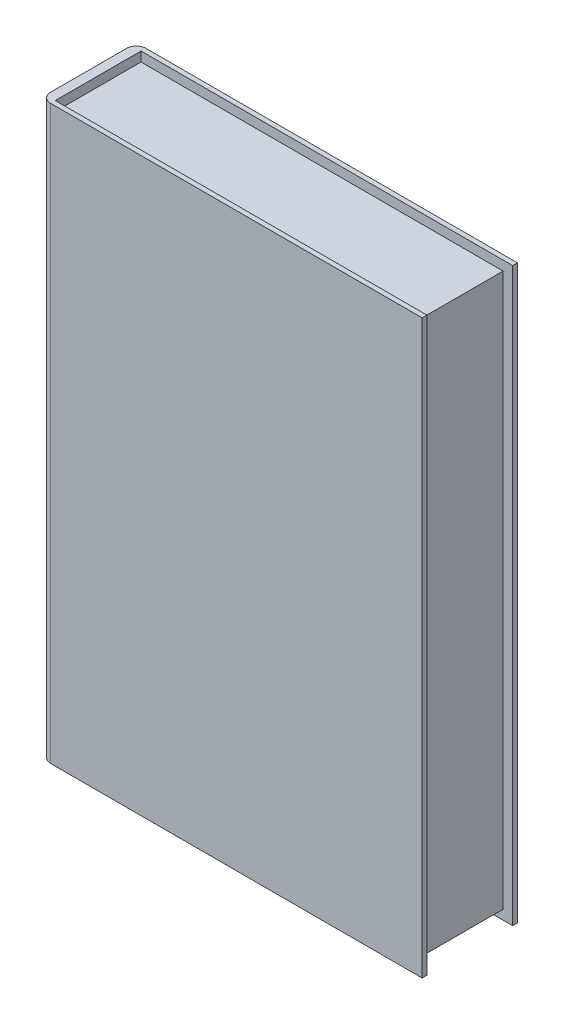
ISO-10303-21;
HEADER;
FILE_DESCRIPTION(('STEP AP214'),'2;1');
FILE_NAME('part.step','',(''),(''),'','','');
FILE_SCHEMA(('AUTOMOTIVE_DESIGN { 1 0 10303 214 1 1 1 1 }'));
ENDSEC;
DATA;
#1=APPLICATION_CONTEXT('core data for automotive mechanical design processes');
#2=APPLICATION_PROTOCOL_DEFINITION('international standard','automotive_design',2000,#1);
#3=PRODUCT_CONTEXT('',#1,'mechanical');
#4=PRODUCT('Part','Part','',(#3));
#5=PRODUCT_RELATED_PRODUCT_CATEGORY('part','',(#4));
#6=PRODUCT_DEFINITION_FORMATION('','',#4);
#7=PRODUCT_DEFINITION_CONTEXT('part definition',#1,'design');
#8=PRODUCT_DEFINITION('design','',#6,#7);
#9=PRODUCT_DEFINITION_SHAPE('','',#8);
#10=(LENGTH_UNIT() NAMED_UNIT(*) SI_UNIT(.MILLI.,.METRE.));
#11=(NAMED_UNIT(*) PLANE_ANGLE_UNIT() SI_UNIT($,.RADIAN.));
#12=(NAMED_UNIT(*) SI_UNIT($,.STERADIAN.) SOLID_ANGLE_UNIT());
#13=UNCERTAINTY_MEASURE_WITH_UNIT(LENGTH_MEASURE(1.E-05),#10,'distance_accuracy_value','');
#14=(GEOMETRIC_REPRESENTATION_CONTEXT(3) GLOBAL_UNCERTAINTY_ASSIGNED_CONTEXT((#13)) GLOBAL_UNIT_ASSIGNED_CONTEXT((#10,
#11,#12)) REPRESENTATION_CONTEXT('',''));
#15=CARTESIAN_POINT('',(0.,0.,0.));
#16=DIRECTION('',(0.,0.,1.));
#17=DIRECTION('',(1.,0.,0.));
#18=AXIS2_PLACEMENT_3D('',#15,#16,#17);
#19=CARTESIAN_POINT('',(78.4210526315789,31.8421052631579,10.));
#20=DIRECTION('',(-1.,0.,0.));
#21=DIRECTION('',(0.,-1.,0.));
#22=AXIS2_PLACEMENT_3D('',#19,#20,#21);
#23=PLANE('',#22);
#24=DIRECTION('',(0.,0.,-1.));
#25=VECTOR('',#24,1.);
#26=CARTESIAN_POINT('',(78.421052631579,-88.1578947368421,10.));
#27=LINE('',#26,#25);
#28=CARTESIAN_POINT('',(78.421052631579,-88.1578947368421,10.));
#29=VERTEX_POINT('',#28);
#30=CARTESIAN_POINT('',(78.421052631579,-88.1578947368421,9.));
#31=VERTEX_POINT('',#30);
#32=EDGE_CURVE('E224',#29,#31,#27,.T.);
#33=ORIENTED_EDGE('',*,*,#32,.T.);
#34=DIRECTION('',(0.,1.,0.));
#35=VECTOR('',#34,1.);
#36=CARTESIAN_POINT('',(78.4210526315789,29.8421052631579,9.));
#37=LINE('',#36,#35);
#38=CARTESIAN_POINT('',(78.4210526315789,31.8421052631579,9.));
#39=VERTEX_POINT('',#38);
#40=EDGE_CURVE('E200',#31,#39,#37,.T.);
#41=ORIENTED_EDGE('',*,*,#40,.T.);
#42=DIRECTION('',(0.,0.,-1.));
#43=VECTOR('',#42,1.);
#44=CARTESIAN_POINT('',(78.4210526315789,31.8421052631579,10.));
#45=LINE('',#44,#43);
#46=CARTESIAN_POINT('',(78.4210526315789,31.8421052631579,10.));
#47=VERTEX_POINT('',#46);
#48=EDGE_CURVE('E220',#47,#39,#45,.T.);
#49=ORIENTED_EDGE('',*,*,#48,.F.);
#50=DIRECTION('',(0.,1.,0.));
#51=VECTOR('',#50,1.);
#52=CARTESIAN_POINT('',(78.4210526315789,31.8421052631579,10.));
#53=LINE('',#52,#51);
#54=EDGE_CURVE('E206',#29,#47,#53,.T.);
#55=ORIENTED_EDGE('',*,*,#54,.F.);
#56=EDGE_LOOP('',(#33,#41,#49,#55));
#57=FACE_BOUND('',#56,.T.);
#58=ADVANCED_FACE('F32',(#57),#23,.F.);
#59=CARTESIAN_POINT('',(76.4210526315789,0.,0.));
#60=DIRECTION('',(1.,0.,0.));
#61=DIRECTION('',(0.,1.,0.));
#62=AXIS2_PLACEMENT_3D('',#59,#60,#61);
#63=PLANE('',#62);
#64=DIRECTION('',(0.,-1.,0.));
#65=VECTOR('',#64,1.);
#66=CARTESIAN_POINT('',(76.4210526315789,29.8421052631579,9.));
#67=LINE('',#66,#65);
#68=CARTESIAN_POINT('',(76.4210526315789,29.8421052631579,9.));
#69=VERTEX_POINT('',#68);
#70=CARTESIAN_POINT('',(76.421052631579,-86.1578947368421,9.));
#71=VERTEX_POINT('',#70);
#72=EDGE_CURVE('E170',#69,#71,#67,.T.);
#73=ORIENTED_EDGE('',*,*,#72,.T.);
#74=DIRECTION('',(0.,0.,-1.));
#75=VECTOR('',#74,1.);
#76=CARTESIAN_POINT('',(76.421052631579,-86.1578947368421,0.));
#77=LINE('',#76,#75);
#78=CARTESIAN_POINT('',(76.421052631579,-86.1578947368421,-9.00000000000001));
#79=VERTEX_POINT('',#78);
#80=EDGE_CURVE('E230',#71,#79,#77,.T.);
#81=ORIENTED_EDGE('',*,*,#80,.T.);
#82=DIRECTION('',(0.,1.,0.));
#83=VECTOR('',#82,1.);
#84=CARTESIAN_POINT('',(76.4210526315789,29.8421052631579,-9.));
#85=LINE('',#84,#83);
#86=CARTESIAN_POINT('',(76.4210526315789,29.8421052631579,-9.));
#87=VERTEX_POINT('',#86);
#88=EDGE_CURVE('E154',#79,#87,#85,.T.);
#89=ORIENTED_EDGE('',*,*,#88,.T.);
#90=DIRECTION('',(0.,0.,1.));
#91=VECTOR('',#90,1.);
#92=CARTESIAN_POINT('',(76.4210526315789,29.8421052631579,9.));
#93=LINE('',#92,#91);
#94=EDGE_CURVE('E175',#87,#69,#93,.T.);
#95=ORIENTED_EDGE('',*,*,#94,.T.);
#96=EDGE_LOOP('',(#73,#81,#89,#95));
#97=FACE_BOUND('',#96,.T.);
#98=ADVANCED_FACE('F275',(#97),#63,.T.);
#99=CARTESIAN_POINT('',(0.,29.8421052631579,0.));
#100=DIRECTION('',(0.,1.,0.));
#101=DIRECTION('',(0.,0.,1.));
#102=AXIS2_PLACEMENT_3D('',#99,#100,#101);
#103=PLANE('',#102);
#104=DIRECTION('',(1.,0.,0.));
#105=VECTOR('',#104,1.);
#106=CARTESIAN_POINT('',(0.421052631578948,29.8421052631579,9.));
#107=LINE('',#106,#105);
#108=CARTESIAN_POINT('',(0.421052631578948,29.8421052631579,9.));
#109=VERTEX_POINT('',#108);
#110=EDGE_CURVE('E182',#109,#69,#107,.T.);
#111=ORIENTED_EDGE('',*,*,#110,.T.);
#112=ORIENTED_EDGE('',*,*,#94,.F.);
#113=DIRECTION('',(-1.,0.,0.));
#114=VECTOR('',#113,1.);
#115=CARTESIAN_POINT('',(0.421052631578945,29.8421052631579,-9.));
#116=LINE('',#115,#114);
#117=CARTESIAN_POINT('',(0.421052631578945,29.8421052631579,-9.));
#118=VERTEX_POINT('',#117);
#119=EDGE_CURVE('E186',#87,#118,#116,.T.);
#120=ORIENTED_EDGE('',*,*,#119,.T.);
#121=DIRECTION('',(0.,0.,1.));
#122=VECTOR('',#121,1.);
#123=CARTESIAN_POINT('',(0.421052631578945,29.8421052631579,-9.));
#124=LINE('',#123,#122);
#125=EDGE_CURVE('E179',#118,#109,#124,.T.);
#126=ORIENTED_EDGE('',*,*,#125,.T.);
#127=EDGE_LOOP('',(#111,#112,#120,#126));
#128=FACE_BOUND('',#127,.T.);
#129=ADVANCED_FACE('F273',(#128),#103,.T.);
#130=CARTESIAN_POINT('',(-1.57894736842105,31.8421052631579,10.));
#131=DIRECTION('',(1.,0.,0.));
#132=DIRECTION('',(0.,1.,0.));
#133=AXIS2_PLACEMENT_3D('',#130,#131,#132);
#134=PLANE('',#133);
#135=DIRECTION('',(0.,0.,-1.));
#136=VECTOR('',#135,1.);
#137=CARTESIAN_POINT('',(-1.57894736842105,31.8421052631579,10.));
#138=LINE('',#137,#136);
#139=CARTESIAN_POINT('',(-1.57894736842105,31.8421052631579,8.));
#140=VERTEX_POINT('',#139);
#141=CARTESIAN_POINT('',(-1.57894736842105,31.8421052631579,-8.));
#142=VERTEX_POINT('',#141);
#143=EDGE_CURVE('E211',#140,#142,#138,.T.);
#144=ORIENTED_EDGE('',*,*,#143,.T.);
#145=DIRECTION('',(0.,-1.,0.));
#146=VECTOR('',#145,1.);
#147=CARTESIAN_POINT('',(-1.57894736842105,31.8421052631579,-8.));
#148=LINE('',#147,#146);
#149=CARTESIAN_POINT('',(-1.57894736842104,-88.1578947368421,-8.));
#150=VERTEX_POINT('',#149);
#151=EDGE_CURVE('E234',#142,#150,#148,.T.);
#152=ORIENTED_EDGE('',*,*,#151,.T.);
#153=DIRECTION('',(0.,0.,-1.));
#154=VECTOR('',#153,1.);
#155=CARTESIAN_POINT('',(-1.57894736842104,-88.1578947368421,10.));
#156=LINE('',#155,#154);
#157=CARTESIAN_POINT('',(-1.57894736842104,-88.1578947368421,8.));
#158=VERTEX_POINT('',#157);
#159=EDGE_CURVE('E227',#158,#150,#156,.T.);
#160=ORIENTED_EDGE('',*,*,#159,.F.);
#161=DIRECTION('',(0.,-1.,0.));
#162=VECTOR('',#161,1.);
#163=CARTESIAN_POINT('',(-1.57894736842105,31.8421052631579,8.));
#164=LINE('',#163,#162);
#165=EDGE_CURVE('E232',#158,#140,#164,.F.);
#166=ORIENTED_EDGE('',*,*,#165,.T.);
#167=EDGE_LOOP('',(#144,#152,#160,#166));
#168=FACE_BOUND('',#167,.T.);
#169=ADVANCED_FACE('F247',(#168),#134,.F.);
#170=CARTESIAN_POINT('',(-1.57894736842104,-88.1578947368421,10.));
#171=DIRECTION('',(0.,1.,0.));
#172=DIRECTION('',(0.,0.,1.));
#173=AXIS2_PLACEMENT_3D('',#170,#171,#172);
#174=PLANE('',#173);
#175=ORIENTED_EDGE('',*,*,#159,.T.);
#176=CARTESIAN_POINT('',(0.42105263157896,-88.1578947368421,-8.));
#177=DIRECTION('',(0.,1.,0.));
#178=DIRECTION('',(0.,0.,1.));
#179=AXIS2_PLACEMENT_3D('',#176,#177,#178);
#180=CIRCLE('',#179,2.);
#181=CARTESIAN_POINT('',(0.42105263157896,-88.1578947368421,-10.));
#182=VERTEX_POINT('',#181);
#183=EDGE_CURVE('E239',#150,#182,#180,.F.);
#184=ORIENTED_EDGE('',*,*,#183,.T.);
#185=DIRECTION('',(1.,0.,0.));
#186=VECTOR('',#185,1.);
#187=CARTESIAN_POINT('',(-1.57894736842104,-88.1578947368421,-10.));
#188=LINE('',#187,#186);
#189=CARTESIAN_POINT('',(78.421052631579,-88.1578947368421,-10.));
#190=VERTEX_POINT('',#189);
#191=EDGE_CURVE('E197',#182,#190,#188,.T.);
#192=ORIENTED_EDGE('',*,*,#191,.T.);
#193=CARTESIAN_POINT('',(78.421052631579,-88.1578947368421,-9.));
#194=VERTEX_POINT('',#193);
#195=EDGE_CURVE('E223',#194,#190,#27,.T.);
#196=ORIENTED_EDGE('',*,*,#195,.F.);
#197=DIRECTION('',(1.,0.,0.));
#198=VECTOR('',#197,1.);
#199=CARTESIAN_POINT('',(0.421052631578962,-88.1578947368421,-9.));
#200=LINE('',#199,#198);
#201=CARTESIAN_POINT('',(0.421052631578962,-88.1578947368421,-9.));
#202=VERTEX_POINT('',#201);
#203=EDGE_CURVE('E164',#202,#194,#200,.T.);
#204=ORIENTED_EDGE('',*,*,#203,.F.);
#205=DIRECTION('',(0.,0.,-1.));
#206=VECTOR('',#205,1.);
#207=CARTESIAN_POINT('',(0.42105263157896,-88.1578947368421,9.));
#208=LINE('',#207,#206);
#209=CARTESIAN_POINT('',(0.42105263157896,-88.1578947368421,9.));
#210=VERTEX_POINT('',#209);
#211=EDGE_CURVE('E143',#210,#202,#208,.T.);
#212=ORIENTED_EDGE('',*,*,#211,.F.);
#213=DIRECTION('',(-1.,0.,0.));
#214=VECTOR('',#213,1.);
#215=CARTESIAN_POINT('',(0.42105263157896,-88.1578947368421,9.));
#216=LINE('',#215,#214);
#217=EDGE_CURVE('E161',#31,#210,#216,.T.);
#218=ORIENTED_EDGE('',*,*,#217,.F.);
#219=ORIENTED_EDGE('',*,*,#32,.F.);
#220=DIRECTION('',(1.,0.,0.));
#221=VECTOR('',#220,1.);
#222=CARTESIAN_POINT('',(-1.57894736842104,-88.1578947368421,10.));
#223=LINE('',#222,#221);
#224=CARTESIAN_POINT('',(0.42105263157896,-88.1578947368421,10.));
#225=VERTEX_POINT('',#224);
#226=EDGE_CURVE('E204',#225,#29,#223,.T.);
#227=ORIENTED_EDGE('',*,*,#226,.F.);
#228=CARTESIAN_POINT('',(0.42105263157896,-88.1578947368421,8.));
#229=DIRECTION('',(0.,1.,0.));
#230=DIRECTION('',(0.,0.,1.));
#231=AXIS2_PLACEMENT_3D('',#228,#229,#230);
#232=CIRCLE('',#231,2.);
#233=EDGE_CURVE('E237',#225,#158,#232,.F.);
#234=ORIENTED_EDGE('',*,*,#233,.T.);
#235=EDGE_LOOP('',(#175,#184,#192,#196,#204,#212,#218,#219,#227,#234));
#236=FACE_BOUND('',#235,.T.);
#237=ADVANCED_FACE('F252',(#236),#174,.F.);
#238=DIRECTION('',(0.,1.,0.));
#239=VECTOR('',#238,1.);
#240=CARTESIAN_POINT('',(78.4210526315789,29.8421052631579,-9.));
#241=LINE('',#240,#239);
#242=CARTESIAN_POINT('',(78.4210526315789,31.8421052631579,-9.));
#243=VERTEX_POINT('',#242);
#244=EDGE_CURVE('E198',#194,#243,#241,.T.);
#245=ORIENTED_EDGE('',*,*,#244,.F.);
#246=ORIENTED_EDGE('',*,*,#195,.T.);
#247=DIRECTION('',(0.,1.,0.));
#248=VECTOR('',#247,1.);
#249=CARTESIAN_POINT('',(78.4210526315789,31.8421052631579,-10.));
#250=LINE('',#249,#248);
#251=CARTESIAN_POINT('',(78.4210526315789,31.8421052631579,-10.));
#252=VERTEX_POINT('',#251);
#253=EDGE_CURVE('E213',#190,#252,#250,.T.);
#254=ORIENTED_EDGE('',*,*,#253,.T.);
#255=EDGE_CURVE('E219',#243,#252,#45,.T.);
#256=ORIENTED_EDGE('',*,*,#255,.F.);
#257=EDGE_LOOP('',(#245,#246,#254,#256));
#258=FACE_BOUND('',#257,.T.);
#259=ADVANCED_FACE('F259',(#258),#23,.F.);
#260=CARTESIAN_POINT('',(-1.57894736842105,31.8421052631579,10.));
#261=DIRECTION('',(0.,-1.,0.));
#262=DIRECTION('',(0.,0.,-1.));
#263=AXIS2_PLACEMENT_3D('',#260,#261,#262);
#264=PLANE('',#263);
#265=DIRECTION('',(-1.,0.,0.));
#266=VECTOR('',#265,1.);
#267=CARTESIAN_POINT('',(-1.57894736842105,31.8421052631579,-10.));
#268=LINE('',#267,#266);
#269=CARTESIAN_POINT('',(0.421052631578945,31.8421052631579,-10.));
#270=VERTEX_POINT('',#269);
#271=EDGE_CURVE('E207',#252,#270,#268,.T.);
#272=ORIENTED_EDGE('',*,*,#271,.T.);
#273=CARTESIAN_POINT('',(0.421052631578945,31.8421052631579,-8.));
#274=DIRECTION('',(0.,-1.,0.));
#275=DIRECTION('',(0.,0.,-1.));
#276=AXIS2_PLACEMENT_3D('',#273,#274,#275);
#277=CIRCLE('',#276,2.);
#278=EDGE_CURVE('E40',#270,#142,#277,.F.);
#279=ORIENTED_EDGE('',*,*,#278,.T.);
#280=ORIENTED_EDGE('',*,*,#143,.F.);
#281=CARTESIAN_POINT('',(0.421052631578945,31.8421052631579,8.));
#282=DIRECTION('',(0.,-1.,0.));
#283=DIRECTION('',(0.,0.,-1.));
#284=AXIS2_PLACEMENT_3D('',#281,#282,#283);
#285=CIRCLE('',#284,2.);
#286=CARTESIAN_POINT('',(0.421052631578945,31.8421052631579,10.));
#287=VERTEX_POINT('',#286);
#288=EDGE_CURVE('E47',#140,#287,#285,.F.);
#289=ORIENTED_EDGE('',*,*,#288,.T.);
#290=DIRECTION('',(-1.,0.,0.));
#291=VECTOR('',#290,1.);
#292=CARTESIAN_POINT('',(-1.57894736842105,31.8421052631579,10.));
#293=LINE('',#292,#291);
#294=EDGE_CURVE('E209',#47,#287,#293,.T.);
#295=ORIENTED_EDGE('',*,*,#294,.F.);
#296=ORIENTED_EDGE('',*,*,#48,.T.);
#297=DIRECTION('',(1.,0.,0.));
#298=VECTOR('',#297,1.);
#299=CARTESIAN_POINT('',(0.421052631578948,31.8421052631579,9.));
#300=LINE('',#299,#298);
#301=CARTESIAN_POINT('',(0.421052631578947,31.8421052631579,9.));
#302=VERTEX_POINT('',#301);
#303=EDGE_CURVE('E190',#302,#39,#300,.T.);
#304=ORIENTED_EDGE('',*,*,#303,.F.);
#305=DIRECTION('',(0.,0.,1.));
#306=VECTOR('',#305,1.);
#307=CARTESIAN_POINT('',(0.421052631578945,31.8421052631579,-9.));
#308=LINE('',#307,#306);
#309=CARTESIAN_POINT('',(0.421052631578945,31.8421052631579,-9.));
#310=VERTEX_POINT('',#309);
#311=EDGE_CURVE('E178',#310,#302,#308,.T.);
#312=ORIENTED_EDGE('',*,*,#311,.F.);
#313=DIRECTION('',(-1.,0.,0.));
#314=VECTOR('',#313,1.);
#315=CARTESIAN_POINT('',(0.421052631578945,31.8421052631579,-9.));
#316=LINE('',#315,#314);
#317=EDGE_CURVE('E183',#243,#310,#316,.T.);
#318=ORIENTED_EDGE('',*,*,#317,.F.);
#319=ORIENTED_EDGE('',*,*,#255,.T.);
#320=EDGE_LOOP('',(#272,#279,#280,#289,#295,#296,#304,#312,#318,#319));
#321=FACE_BOUND('',#320,.T.);
#322=ADVANCED_FACE('F243',(#321),#264,.F.);
#323=CARTESIAN_POINT('',(0.,0.,10.));
#324=DIRECTION('',(0.,0.,1.));
#325=DIRECTION('',(1.,0.,0.));
#326=AXIS2_PLACEMENT_3D('',#323,#324,#325);
#327=PLANE('',#326);
#328=ORIENTED_EDGE('',*,*,#294,.T.);
#329=DIRECTION('',(0.,-1.,0.));
#330=VECTOR('',#329,1.);
#331=CARTESIAN_POINT('',(0.42105263157896,-88.1578947368421,10.));
#332=LINE('',#331,#330);
#333=EDGE_CURVE('E11',#287,#225,#332,.T.);
#334=ORIENTED_EDGE('',*,*,#333,.T.);
#335=ORIENTED_EDGE('',*,*,#226,.T.);
#336=ORIENTED_EDGE('',*,*,#54,.T.);
#337=EDGE_LOOP('',(#328,#334,#335,#336));
#338=FACE_BOUND('',#337,.T.);
#339=ADVANCED_FACE('F282',(#338),#327,.T.);
#340=CARTESIAN_POINT('',(0.,0.,-10.));
#341=DIRECTION('',(0.,0.,1.));
#342=DIRECTION('',(1.,0.,0.));
#343=AXIS2_PLACEMENT_3D('',#340,#341,#342);
#344=PLANE('',#343);
#345=ORIENTED_EDGE('',*,*,#191,.F.);
#346=DIRECTION('',(0.,-1.,0.));
#347=VECTOR('',#346,1.);
#348=CARTESIAN_POINT('',(0.421052631578949,0.,-10.));
#349=LINE('',#348,#347);
#350=EDGE_CURVE('E55',#182,#270,#349,.F.);
#351=ORIENTED_EDGE('',*,*,#350,.T.);
#352=ORIENTED_EDGE('',*,*,#271,.F.);
#353=ORIENTED_EDGE('',*,*,#253,.F.);
#354=EDGE_LOOP('',(#345,#351,#352,#353));
#355=FACE_BOUND('',#354,.T.);
#356=ADVANCED_FACE('F256',(#355),#344,.F.);
#357=CARTESIAN_POINT('',(0.421052631578945,29.8421052631579,-9.));
#358=DIRECTION('',(-1.,0.,0.));
#359=DIRECTION('',(0.,0.,1.));
#360=AXIS2_PLACEMENT_3D('',#357,#358,#359);
#361=PLANE('',#360);
#362=ORIENTED_EDGE('',*,*,#311,.T.);
#363=DIRECTION('',(0.,1.,0.));
#364=VECTOR('',#363,1.);
#365=CARTESIAN_POINT('',(0.421052631578948,29.8421052631579,9.));
#366=LINE('',#365,#364);
#367=EDGE_CURVE('E188',#109,#302,#366,.T.);
#368=ORIENTED_EDGE('',*,*,#367,.F.);
#369=ORIENTED_EDGE('',*,*,#125,.F.);
#370=DIRECTION('',(0.,1.,0.));
#371=VECTOR('',#370,1.);
#372=CARTESIAN_POINT('',(0.421052631578945,29.8421052631579,-9.));
#373=LINE('',#372,#371);
#374=EDGE_CURVE('E195',#118,#310,#373,.T.);
#375=ORIENTED_EDGE('',*,*,#374,.T.);
#376=EDGE_LOOP('',(#362,#368,#369,#375));
#377=FACE_BOUND('',#376,.T.);
#378=ADVANCED_FACE('F266',(#377),#361,.F.);
#379=CARTESIAN_POINT('',(0.421052631578945,29.8421052631579,-9.));
#380=DIRECTION('',(0.,0.,-1.));
#381=DIRECTION('',(-1.,0.,0.));
#382=AXIS2_PLACEMENT_3D('',#379,#380,#381);
#383=PLANE('',#382);
#384=ORIENTED_EDGE('',*,*,#203,.T.);
#385=ORIENTED_EDGE('',*,*,#244,.T.);
#386=ORIENTED_EDGE('',*,*,#317,.T.);
#387=ORIENTED_EDGE('',*,*,#374,.F.);
#388=ORIENTED_EDGE('',*,*,#119,.F.);
#389=ORIENTED_EDGE('',*,*,#88,.F.);
#390=DIRECTION('',(1.,0.,0.));
#391=VECTOR('',#390,1.);
#392=CARTESIAN_POINT('',(0.421052631578962,-86.1578947368421,-9.));
#393=LINE('',#392,#391);
#394=CARTESIAN_POINT('',(0.421052631578962,-86.1578947368421,-9.));
#395=VERTEX_POINT('',#394);
#396=EDGE_CURVE('E151',#395,#79,#393,.T.);
#397=ORIENTED_EDGE('',*,*,#396,.F.);
#398=DIRECTION('',(0.,-1.,0.));
#399=VECTOR('',#398,1.);
#400=CARTESIAN_POINT('',(0.421052631578962,-86.1578947368421,-9.));
#401=LINE('',#400,#399);
#402=EDGE_CURVE('E137',#395,#202,#401,.T.);
#403=ORIENTED_EDGE('',*,*,#402,.T.);
#404=EDGE_LOOP('',(#384,#385,#386,#387,#388,#389,#397,#403));
#405=FACE_BOUND('',#404,.T.);
#406=ADVANCED_FACE('F152',(#405),#383,.F.);
#407=CARTESIAN_POINT('',(0.421052631578948,29.8421052631579,9.));
#408=DIRECTION('',(0.,0.,1.));
#409=DIRECTION('',(1.,0.,0.));
#410=AXIS2_PLACEMENT_3D('',#407,#408,#409);
#411=PLANE('',#410);
#412=ORIENTED_EDGE('',*,*,#40,.F.);
#413=ORIENTED_EDGE('',*,*,#217,.T.);
#414=DIRECTION('',(0.,-1.,0.));
#415=VECTOR('',#414,1.);
#416=CARTESIAN_POINT('',(0.42105263157896,-86.1578947368421,9.));
#417=LINE('',#416,#415);
#418=CARTESIAN_POINT('',(0.42105263157896,-86.1578947368421,9.));
#419=VERTEX_POINT('',#418);
#420=EDGE_CURVE('E147',#419,#210,#417,.T.);
#421=ORIENTED_EDGE('',*,*,#420,.F.);
#422=DIRECTION('',(-1.,0.,0.));
#423=VECTOR('',#422,1.);
#424=CARTESIAN_POINT('',(0.42105263157896,-86.1578947368421,9.));
#425=LINE('',#424,#423);
#426=EDGE_CURVE('E148',#71,#419,#425,.T.);
#427=ORIENTED_EDGE('',*,*,#426,.F.);
#428=ORIENTED_EDGE('',*,*,#72,.F.);
#429=ORIENTED_EDGE('',*,*,#110,.F.);
#430=ORIENTED_EDGE('',*,*,#367,.T.);
#431=ORIENTED_EDGE('',*,*,#303,.T.);
#432=EDGE_LOOP('',(#412,#413,#421,#427,#428,#429,#430,#431));
#433=FACE_BOUND('',#432,.T.);
#434=ADVANCED_FACE('F270',(#433),#411,.F.);
#435=CARTESIAN_POINT('',(0.42105263157896,-86.1578947368421,9.));
#436=DIRECTION('',(-1.,0.,0.));
#437=DIRECTION('',(0.,0.,1.));
#438=AXIS2_PLACEMENT_3D('',#435,#436,#437);
#439=PLANE('',#438);
#440=ORIENTED_EDGE('',*,*,#211,.T.);
#441=ORIENTED_EDGE('',*,*,#402,.F.);
#442=DIRECTION('',(0.,0.,-1.));
#443=VECTOR('',#442,1.);
#444=CARTESIAN_POINT('',(0.42105263157896,-86.1578947368421,9.));
#445=LINE('',#444,#443);
#446=EDGE_CURVE('E141',#419,#395,#445,.T.);
#447=ORIENTED_EDGE('',*,*,#446,.F.);
#448=ORIENTED_EDGE('',*,*,#420,.T.);
#449=EDGE_LOOP('',(#440,#441,#447,#448));
#450=FACE_BOUND('',#449,.T.);
#451=ADVANCED_FACE('F139',(#450),#439,.F.);
#452=CARTESIAN_POINT('',(0.,-86.1578947368421,0.));
#453=DIRECTION('',(0.,-1.,0.));
#454=DIRECTION('',(0.,0.,-1.));
#455=AXIS2_PLACEMENT_3D('',#452,#453,#454);
#456=PLANE('',#455);
#457=ORIENTED_EDGE('',*,*,#426,.T.);
#458=ORIENTED_EDGE('',*,*,#446,.T.);
#459=ORIENTED_EDGE('',*,*,#396,.T.);
#460=ORIENTED_EDGE('',*,*,#80,.F.);
#461=EDGE_LOOP('',(#457,#458,#459,#460));
#462=FACE_BOUND('',#461,.T.);
#463=ADVANCED_FACE('F158',(#462),#456,.T.);
#464=CARTESIAN_POINT('',(0.421052631578945,31.8421052631579,-8.));
#465=DIRECTION('',(0.,-1.,0.));
#466=DIRECTION('',(1.,0.,0.));
#467=AXIS2_PLACEMENT_3D('',#464,#465,#466);
#468=CYLINDRICAL_SURFACE('',#467,2.);
#469=ORIENTED_EDGE('',*,*,#278,.F.);
#470=ORIENTED_EDGE('',*,*,#350,.F.);
#471=ORIENTED_EDGE('',*,*,#183,.F.);
#472=ORIENTED_EDGE('',*,*,#151,.F.);
#473=EDGE_LOOP('',(#469,#470,#471,#472));
#474=FACE_BOUND('',#473,.T.);
#475=ADVANCED_FACE('F250',(#474),#468,.T.);
#476=CARTESIAN_POINT('',(0.421052631578949,0.,8.));
#477=DIRECTION('',(0.,1.,0.));
#478=DIRECTION('',(-1.,0.,0.));
#479=AXIS2_PLACEMENT_3D('',#476,#477,#478);
#480=CYLINDRICAL_SURFACE('',#479,2.);
#481=ORIENTED_EDGE('',*,*,#288,.F.);
#482=ORIENTED_EDGE('',*,*,#165,.F.);
#483=ORIENTED_EDGE('',*,*,#233,.F.);
#484=ORIENTED_EDGE('',*,*,#333,.F.);
#485=EDGE_LOOP('',(#481,#482,#483,#484));
#486=FACE_BOUND('',#485,.T.);
#487=ADVANCED_FACE('F34',(#486),#480,.T.);
#488=CLOSED_SHELL('',(#58,#98,#129,#169,#237,#259,#322,#339,#356,#378,#406,#434,#451,#463,#475,#487));
#489=MANIFOLD_SOLID_BREP('B2',#488);
#490=ADVANCED_BREP_SHAPE_REPRESENTATION('',(#18,#489),#14);
#491=SHAPE_DEFINITION_REPRESENTATION(#9,#490);
ENDSEC;
END-ISO-10303-21;
